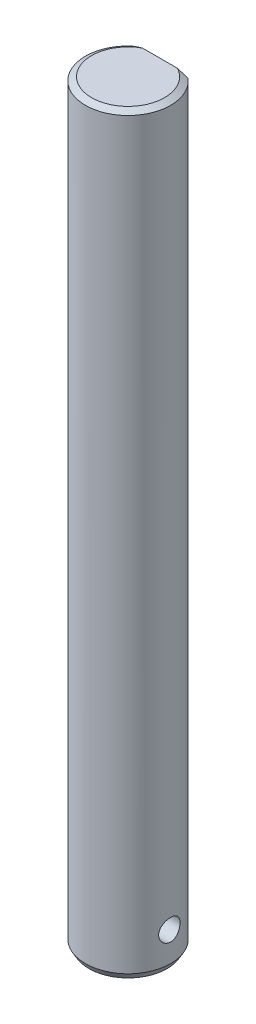
ISO-10303-21;
HEADER;
FILE_DESCRIPTION(('STEP AP214'),'2;1');
FILE_NAME('part.step','',(''),(''),'','','');
FILE_SCHEMA(('AUTOMOTIVE_DESIGN { 1 0 10303 214 1 1 1 1 }'));
ENDSEC;
DATA;
#1=APPLICATION_CONTEXT('core data for automotive mechanical design processes');
#2=APPLICATION_PROTOCOL_DEFINITION('international standard','automotive_design',2000,#1);
#3=PRODUCT_CONTEXT('',#1,'mechanical');
#4=PRODUCT('Part','Part','',(#3));
#5=PRODUCT_RELATED_PRODUCT_CATEGORY('part','',(#4));
#6=PRODUCT_DEFINITION_FORMATION('','',#4);
#7=PRODUCT_DEFINITION_CONTEXT('part definition',#1,'design');
#8=PRODUCT_DEFINITION('design','',#6,#7);
#9=PRODUCT_DEFINITION_SHAPE('','',#8);
#10=(LENGTH_UNIT() NAMED_UNIT(*) SI_UNIT(.MILLI.,.METRE.));
#11=(NAMED_UNIT(*) PLANE_ANGLE_UNIT() SI_UNIT($,.RADIAN.));
#12=(NAMED_UNIT(*) SI_UNIT($,.STERADIAN.) SOLID_ANGLE_UNIT());
#13=UNCERTAINTY_MEASURE_WITH_UNIT(LENGTH_MEASURE(1.E-05),#10,'distance_accuracy_value','');
#14=(GEOMETRIC_REPRESENTATION_CONTEXT(3) GLOBAL_UNCERTAINTY_ASSIGNED_CONTEXT((#13)) GLOBAL_UNIT_ASSIGNED_CONTEXT((#10,
#11,#12)) REPRESENTATION_CONTEXT('',''));
#15=CARTESIAN_POINT('',(0.,0.,0.));
#16=DIRECTION('',(0.,0.,1.));
#17=DIRECTION('',(1.,0.,0.));
#18=AXIS2_PLACEMENT_3D('',#15,#16,#17);
#19=CARTESIAN_POINT('',(0.,106.,0.));
#20=DIRECTION('',(0.,-1.,0.));
#21=DIRECTION('',(0.,0.,-1.));
#22=AXIS2_PLACEMENT_3D('',#19,#20,#21);
#23=CYLINDRICAL_SURFACE('',#22,6.);
#24=CARTESIAN_POINT('',(0.,0.866025403784457,0.));
#25=DIRECTION('',(0.,1.,0.));
#26=DIRECTION('',(0.,0.,1.));
#27=AXIS2_PLACEMENT_3D('',#24,#25,#26);
#28=CIRCLE('',#27,6.);
#29=CARTESIAN_POINT('',(0.,0.866025403784457,6.));
#30=VERTEX_POINT('',#29);
#31=EDGE_CURVE('E140',#30,#30,#28,.T.);
#32=ORIENTED_EDGE('',*,*,#31,.T.);
#33=EDGE_LOOP('',(#32));
#34=FACE_BOUND('',#33,.T.);
#35=CARTESIAN_POINT('',(-5.80947501931113,5.,-1.5));
#36=CARTESIAN_POINT('',(-5.80947660051185,5.08283045055477,-1.49999764715507));
#37=CARTESIAN_POINT('',(-5.81126583608348,5.1656869392068,-1.49311574729838));
#38=CARTESIAN_POINT('',(-5.81821117195949,5.32902054690442,-1.46581387527849));
#39=CARTESIAN_POINT('',(-5.82336923173088,5.409496252681,-1.44538602404532));
#40=CARTESIAN_POINT('',(-5.8364323475758,5.56568212291223,-1.39169471977917));
#41=CARTESIAN_POINT('',(-5.84433385614245,5.6413982932314,-1.35844783671268));
#42=CARTESIAN_POINT('',(-5.86198915217285,5.78618651152395,-1.28011268475685));
#43=CARTESIAN_POINT('',(-5.87174301827101,5.85525827724814,-1.23502391313642));
#44=CARTESIAN_POINT('',(-5.89224429813367,5.98631698715732,-1.13322505638713));
#45=CARTESIAN_POINT('',(-5.90300758573818,6.04813616021003,-1.07630213262243));
#46=CARTESIAN_POINT('',(-5.92417725309178,6.16145683661621,-0.9529092384604));
#47=CARTESIAN_POINT('',(-5.93458359939834,6.21295737537305,-0.886438376508185));
#48=CARTESIAN_POINT('',(-5.95404249312349,6.30486528057877,-0.744687120647373));
#49=CARTESIAN_POINT('',(-5.96307412440355,6.34510783289688,-0.669296745717072));
#50=CARTESIAN_POINT('',(-5.97858487155591,6.41228578649185,-0.512557910575658));
#51=CARTESIAN_POINT('',(-5.98506436400607,6.43922315114931,-0.431210331475164));
#52=CARTESIAN_POINT('',(-5.99462855308908,6.47848870074715,-0.266615255252497));
#53=CARTESIAN_POINT('',(-5.99777936306589,6.49110178659595,-0.183439631729385));
#54=CARTESIAN_POINT('',(-6.00056156464379,6.50225502756533,-0.0160972915576617));
#55=CARTESIAN_POINT('',(-6.00019347658022,6.50079726332576,0.068069276722841));
#56=CARTESIAN_POINT('',(-5.99602856972121,6.48405508984991,0.233028370758581));
#57=CARTESIAN_POINT('',(-5.99230801404524,6.46907820496769,0.313854323401601));
#58=CARTESIAN_POINT('',(-5.98194501914912,6.4262172379709,0.47180737112053));
#59=CARTESIAN_POINT('',(-5.97530242439065,6.39833246877356,0.548934269055657));
#60=CARTESIAN_POINT('',(-5.95972505820537,6.33019845758776,0.69811005525271));
#61=CARTESIAN_POINT('',(-5.95077011817032,6.28983977320295,0.770106764649756));
#62=CARTESIAN_POINT('',(-5.9315394228579,6.19798659253025,0.906413433510733));
#63=CARTESIAN_POINT('',(-5.92126343791494,6.14649015886363,0.970722052628258));
#64=CARTESIAN_POINT('',(-5.90018228261712,6.03217475481058,1.09166105262743));
#65=CARTESIAN_POINT('',(-5.88937031715551,5.96908706459134,1.1480365186128));
#66=CARTESIAN_POINT('',(-5.86869026110024,5.83424001587585,1.24946456394453));
#67=CARTESIAN_POINT('',(-5.85882221463582,5.7624802523054,1.29451661406903));
#68=CARTESIAN_POINT('',(-5.84112298098989,5.61182597951062,1.3721821935339));
#69=CARTESIAN_POINT('',(-5.83330190235432,5.53289856181208,1.40473435045574));
#70=CARTESIAN_POINT('',(-5.82071184083974,5.37044871915413,1.45602843095451));
#71=CARTESIAN_POINT('',(-5.81594220486131,5.28692728161012,1.47477330982937));
#72=CARTESIAN_POINT('',(-5.81013213623485,5.12002429908613,1.49749778319911));
#73=CARTESIAN_POINT('',(-5.80899653456189,5.03669732400222,1.50185428435178));
#74=CARTESIAN_POINT('',(-5.81032406088624,4.8705068380531,1.49671019430933));
#75=CARTESIAN_POINT('',(-5.8127868576076,4.78764328522926,1.48721087870928));
#76=CARTESIAN_POINT('',(-5.82094249172736,4.62613144102718,1.4549552783626));
#77=CARTESIAN_POINT('',(-5.82658182140625,4.54743636405749,1.43241844096905));
#78=CARTESIAN_POINT('',(-5.84040430962577,4.39494112528899,1.37497084900237));
#79=CARTESIAN_POINT('',(-5.84858776949168,4.3211415445668,1.34005862862753));
#80=CARTESIAN_POINT('',(-5.86677682255957,4.17893523327959,1.25806240076193));
#81=CARTESIAN_POINT('',(-5.87681501163985,4.11066269597414,1.21075305230138));
#82=CARTESIAN_POINT('',(-5.8975024984303,3.98288698231919,1.10559043940168));
#83=CARTESIAN_POINT('',(-5.90815189637082,3.92338525000996,1.04773544220816));
#84=CARTESIAN_POINT('',(-5.92918441818964,3.81331337445743,0.921394081477089));
#85=CARTESIAN_POINT('',(-5.93955421237102,3.76300396247071,0.85267792879739));
#86=CARTESIAN_POINT('',(-5.95858329968241,3.67463847982925,0.707554024042014));
#87=CARTESIAN_POINT('',(-5.96724268202376,3.63658177003508,0.631146673436387));
#88=CARTESIAN_POINT('',(-5.98182069442989,3.57413237928324,0.473337302596636));
#89=CARTESIAN_POINT('',(-5.98775898013446,3.54964142937256,0.391976071541822));
#90=CARTESIAN_POINT('',(-5.99631176037473,3.51472379923495,0.226124640478212));
#91=CARTESIAN_POINT('',(-5.99892689636045,3.50429440475657,0.141635047561866));
#92=CARTESIAN_POINT('',(-6.00051254113217,3.4979486156367,-0.0256252896649885));
#93=CARTESIAN_POINT('',(-5.99957968320012,3.50164743635692,-0.108380740449049));
#94=CARTESIAN_POINT('',(-5.99438844686135,3.5225717409415,-0.272051244622108));
#95=CARTESIAN_POINT('',(-5.99013016735643,3.53979682251965,-0.352966352671329));
#96=CARTESIAN_POINT('',(-5.97878149280944,3.58707832965639,-0.510256553467223));
#97=CARTESIAN_POINT('',(-5.97170646753999,3.61706517997194,-0.586653741871527));
#98=CARTESIAN_POINT('',(-5.95546933370076,3.68895586852899,-0.733375579562202));
#99=CARTESIAN_POINT('',(-5.94630696206604,3.73086120900435,-0.803699461897576));
#100=CARTESIAN_POINT('',(-5.92660874521999,3.82657285099561,-0.938102892635848));
#101=CARTESIAN_POINT('',(-5.91604525418417,3.88064021436107,-1.00199248245088));
#102=CARTESIAN_POINT('',(-5.89485973579863,3.9986342779607,-1.11992253040688));
#103=CARTESIAN_POINT('',(-5.88423769428834,4.06256347414686,-1.17396048760228));
#104=CARTESIAN_POINT('',(-5.86391213790822,4.199902121302,-1.27164303971884));
#105=CARTESIAN_POINT('',(-5.85422945594827,4.27346618511894,-1.31507492916982));
#106=CARTESIAN_POINT('',(-5.83715933325924,4.42708323488405,-1.3888903449235));
#107=CARTESIAN_POINT('',(-5.82977022370054,4.50713144916011,-1.41928336463958));
#108=CARTESIAN_POINT('',(-5.81927863109675,4.65586551774007,-1.46163379284816));
#109=CARTESIAN_POINT('',(-5.8156299450082,4.72383974657579,-1.47598975589307));
#110=CARTESIAN_POINT('',(-5.81072757878358,4.86120330349994,-1.4951734388599));
#111=CARTESIAN_POINT('',(-5.80947369434945,4.93059251036759,-1.50000197155828));
#112=CARTESIAN_POINT('',(-5.80947501931113,5.,-1.5));
#113=B_SPLINE_CURVE_WITH_KNOTS('',3,(#35,#36,#37,#38,#39,#40,#41,#42,#43,#44,#45,#46,#47,#48,
#49,#50,#51,#52,#53,#54,#55,#56,#57,#58,#59,#60,#61,#62,#63,#64,#65,#66,#67,#68,#69,#70,#71,#72,
#73,#74,#75,#76,#77,#78,#79,#80,#81,#82,#83,#84,#85,#86,#87,#88,#89,#90,#91,#92,#93,#94,#95,#96,
#97,#98,#99,#100,#101,#102,#103,#104,#105,#106,#107,#108,#109,#110,#111,#112),.UNSPECIFIED.,.T.,
.F.,(4,2,2,2,2,2,2,2,2,2,2,2,2,2,2,2,2,2,2,2,2,2,2,2,2,2,2,2,2,2,2,2,2,2,2,2,2,2,4),(0.,
0.248236465041681,0.4966174448572,0.744678436299613,0.99274996053287,1.24574372515786,
1.4987611288792,1.75530897838752,2.01181895908255,2.26313250597208,2.51440889199612,
2.76010957613368,3.00582334034872,3.25375724552667,3.50173431281348,3.75642279943147,
4.01112318719881,4.26705859205042,4.52293920077729,4.7720614485703,5.02116076310281,
5.26618443005524,5.51123712852851,5.76109707515495,6.01099811331027,6.26715198579191,
6.52329249431732,6.77755243684158,7.03176329345423,7.27910067676474,7.52643070426189,
7.77242925935827,8.01845883442843,8.27038257949243,8.52237018939306,8.77905886370806,
9.03556032819972,9.24358696306398,9.45159585059713),.UNSPECIFIED.);
#114=CARTESIAN_POINT('',(-5.80947501931113,5.,-1.5));
#115=VERTEX_POINT('',#114);
#116=EDGE_CURVE('E93',#115,#115,#113,.T.);
#117=ORIENTED_EDGE('',*,*,#116,.T.);
#118=EDGE_LOOP('',(#117));
#119=FACE_BOUND('',#118,.T.);
#120=CARTESIAN_POINT('',(5.80947501931113,5.,-1.5));
#121=CARTESIAN_POINT('',(5.80947660051185,4.91716954944524,-1.49999764715507));
#122=CARTESIAN_POINT('',(5.81126583608348,4.8343130607932,-1.49311574729838));
#123=CARTESIAN_POINT('',(5.81821117195949,4.67097945309558,-1.46581387527849));
#124=CARTESIAN_POINT('',(5.82336923173088,4.590503747319,-1.44538602404532));
#125=CARTESIAN_POINT('',(5.8364323475758,4.43431787708778,-1.39169471977917));
#126=CARTESIAN_POINT('',(5.84433385614245,4.3586017067686,-1.35844783671268));
#127=CARTESIAN_POINT('',(5.86198915217285,4.21381348847605,-1.28011268475685));
#128=CARTESIAN_POINT('',(5.87174301827101,4.14474172275187,-1.23502391313642));
#129=CARTESIAN_POINT('',(5.89224429813367,4.01368301284268,-1.13322505638713));
#130=CARTESIAN_POINT('',(5.90300758573818,3.95186383978997,-1.07630213262243));
#131=CARTESIAN_POINT('',(5.92417725309178,3.8385431633838,-0.952909238460399));
#132=CARTESIAN_POINT('',(5.93458359939834,3.78704262462695,-0.886438376508185));
#133=CARTESIAN_POINT('',(5.95404249312349,3.69513471942123,-0.744687120647373));
#134=CARTESIAN_POINT('',(5.96307412440355,3.65489216710312,-0.669296745717072));
#135=CARTESIAN_POINT('',(5.97858487155591,3.58771421350815,-0.512557910575658));
#136=CARTESIAN_POINT('',(5.98506436400607,3.56077684885069,-0.431210331475164));
#137=CARTESIAN_POINT('',(5.99462855308908,3.52151129925285,-0.266615255252497));
#138=CARTESIAN_POINT('',(5.99777936306589,3.50889821340405,-0.183439631729385));
#139=CARTESIAN_POINT('',(6.00056156464379,3.49774497243467,-0.0160972915576617));
#140=CARTESIAN_POINT('',(6.00019347658022,3.49920273667424,0.0680692767228411));
#141=CARTESIAN_POINT('',(5.99602856972121,3.51594491015009,0.233028370758581));
#142=CARTESIAN_POINT('',(5.99230801404524,3.53092179503231,0.3138543234016));
#143=CARTESIAN_POINT('',(5.98194501914912,3.5737827620291,0.471807371120529));
#144=CARTESIAN_POINT('',(5.97530242439065,3.60166753122645,0.548934269055657));
#145=CARTESIAN_POINT('',(5.95972505820537,3.66980154241224,0.69811005525271));
#146=CARTESIAN_POINT('',(5.95077011817032,3.71016022679705,0.770106764649757));
#147=CARTESIAN_POINT('',(5.9315394228579,3.80201340746975,0.906413433510733));
#148=CARTESIAN_POINT('',(5.92126343791494,3.85350984113637,0.970722052628258));
#149=CARTESIAN_POINT('',(5.90018228261712,3.96782524518943,1.09166105262743));
#150=CARTESIAN_POINT('',(5.88937031715551,4.03091293540867,1.1480365186128));
#151=CARTESIAN_POINT('',(5.86869026110024,4.16575998412415,1.24946456394453));
#152=CARTESIAN_POINT('',(5.85882221463582,4.2375197476946,1.29451661406903));
#153=CARTESIAN_POINT('',(5.84112298098989,4.38817402048938,1.3721821935339));
#154=CARTESIAN_POINT('',(5.83330190235432,4.46710143818792,1.40473435045574));
#155=CARTESIAN_POINT('',(5.82071184083974,4.62955128084587,1.45602843095451));
#156=CARTESIAN_POINT('',(5.81594220486131,4.71307271838988,1.47477330982937));
#157=CARTESIAN_POINT('',(5.81013213623485,4.87997570091387,1.49749778319911));
#158=CARTESIAN_POINT('',(5.80899653456189,4.96330267599778,1.50185428435178));
#159=CARTESIAN_POINT('',(5.81032406088624,5.1294931619469,1.49671019430933));
#160=CARTESIAN_POINT('',(5.8127868576076,5.21235671477075,1.48721087870928));
#161=CARTESIAN_POINT('',(5.82094249172736,5.37386855897283,1.4549552783626));
#162=CARTESIAN_POINT('',(5.82658182140625,5.45256363594251,1.43241844096905));
#163=CARTESIAN_POINT('',(5.84040430962577,5.60505887471101,1.37497084900237));
#164=CARTESIAN_POINT('',(5.84858776949168,5.6788584554332,1.34005862862753));
#165=CARTESIAN_POINT('',(5.86677682255957,5.82106476672041,1.25806240076193));
#166=CARTESIAN_POINT('',(5.87681501163985,5.88933730402586,1.21075305230138));
#167=CARTESIAN_POINT('',(5.8975024984303,6.01711301768081,1.10559043940168));
#168=CARTESIAN_POINT('',(5.90815189637082,6.07661474999005,1.04773544220816));
#169=CARTESIAN_POINT('',(5.92918441818964,6.18668662554258,0.921394081477089));
#170=CARTESIAN_POINT('',(5.93955421237102,6.23699603752929,0.852677928797389));
#171=CARTESIAN_POINT('',(5.95858329968241,6.32536152017075,0.707554024042014));
#172=CARTESIAN_POINT('',(5.96724268202376,6.36341822996493,0.631146673436387));
#173=CARTESIAN_POINT('',(5.98182069442989,6.42586762071676,0.473337302596636));
#174=CARTESIAN_POINT('',(5.98775898013446,6.45035857062744,0.391976071541822));
#175=CARTESIAN_POINT('',(5.99631176037473,6.48527620076505,0.226124640478212));
#176=CARTESIAN_POINT('',(5.99892689636045,6.49570559524343,0.141635047561866));
#177=CARTESIAN_POINT('',(6.00051254113217,6.5020513843633,-0.0256252896649894));
#178=CARTESIAN_POINT('',(5.99957968320012,6.49835256364309,-0.10838074044905));
#179=CARTESIAN_POINT('',(5.99438844686135,6.47742825905851,-0.27205124462211));
#180=CARTESIAN_POINT('',(5.99013016735643,6.46020317748035,-0.35296635267133));
#181=CARTESIAN_POINT('',(5.97878149280944,6.41292167034361,-0.510256553467224));
#182=CARTESIAN_POINT('',(5.97170646753999,6.38293482002806,-0.586653741871528));
#183=CARTESIAN_POINT('',(5.95546933370076,6.31104413147101,-0.733375579562203));
#184=CARTESIAN_POINT('',(5.94630696206604,6.26913879099565,-0.803699461897577));
#185=CARTESIAN_POINT('',(5.92660874521999,6.17342714900439,-0.938102892635849));
#186=CARTESIAN_POINT('',(5.91604525418417,6.11935978563894,-1.00199248245088));
#187=CARTESIAN_POINT('',(5.89485973579863,6.0013657220393,-1.11992253040688));
#188=CARTESIAN_POINT('',(5.88423769428834,5.93743652585314,-1.17396048760228));
#189=CARTESIAN_POINT('',(5.86391213790822,5.800097878698,-1.27164303971884));
#190=CARTESIAN_POINT('',(5.85422945594827,5.72653381488106,-1.31507492916982));
#191=CARTESIAN_POINT('',(5.83715933325924,5.57291676511595,-1.3888903449235));
#192=CARTESIAN_POINT('',(5.82977022370054,5.49286855083989,-1.41928336463958));
#193=CARTESIAN_POINT('',(5.81927863109675,5.34413448225993,-1.46163379284816));
#194=CARTESIAN_POINT('',(5.8156299450082,5.27616025342421,-1.47598975589307));
#195=CARTESIAN_POINT('',(5.81072757878358,5.13879669650006,-1.4951734388599));
#196=CARTESIAN_POINT('',(5.80947369434945,5.06940748963241,-1.50000197155828));
#197=CARTESIAN_POINT('',(5.80947501931113,5.,-1.5));
#198=B_SPLINE_CURVE_WITH_KNOTS('',3,(#120,#121,#122,#123,#124,#125,#126,#127,#128,#129,#130,
#131,#132,#133,#134,#135,#136,#137,#138,#139,#140,#141,#142,#143,#144,#145,#146,#147,#148,#149,
#150,#151,#152,#153,#154,#155,#156,#157,#158,#159,#160,#161,#162,#163,#164,#165,#166,#167,#168,
#169,#170,#171,#172,#173,#174,#175,#176,#177,#178,#179,#180,#181,#182,#183,#184,#185,#186,#187,
#188,#189,#190,#191,#192,#193,#194,#195,#196,#197),.UNSPECIFIED.,.T.,.F.,(4,2,2,2,2,2,2,2,2,2,2,
2,2,2,2,2,2,2,2,2,2,2,2,2,2,2,2,2,2,2,2,2,2,2,2,2,2,2,4),(0.,0.248236465041681,0.4966174448572,
0.744678436299613,0.99274996053287,1.24574372515786,1.4987611288792,1.75530897838752,
2.01181895908255,2.26313250597208,2.51440889199612,2.76010957613368,3.00582334034872,
3.25375724552667,3.50173431281348,3.75642279943147,4.01112318719881,4.26705859205042,
4.52293920077729,4.7720614485703,5.02116076310281,5.26618443005524,5.51123712852851,
5.76109707515494,6.01099811331027,6.26715198579191,6.52329249431732,6.77755243684158,
7.03176329345423,7.27910067676474,7.52643070426189,7.77242925935827,8.01845883442843,
8.27038257949242,8.52237018939305,8.77905886370806,9.03556032819972,9.24358696306398,
9.45159585059712),.UNSPECIFIED.);
#199=CARTESIAN_POINT('',(5.80947501931113,5.,-1.5));
#200=VERTEX_POINT('',#199);
#201=EDGE_CURVE('E97',#200,#200,#198,.T.);
#202=ORIENTED_EDGE('',*,*,#201,.T.);
#203=EDGE_LOOP('',(#202));
#204=FACE_BOUND('',#203,.T.);
#205=DIRECTION('',(0.,-1.,0.));
#206=VECTOR('',#205,1.);
#207=CARTESIAN_POINT('',(3.96862696659689,106.,-4.5));
#208=LINE('',#207,#206);
#209=CARTESIAN_POINT('',(3.96862696659689,96.,-4.5));
#210=VERTEX_POINT('',#209);
#211=CARTESIAN_POINT('',(3.96862696659689,105.5,-4.5));
#212=VERTEX_POINT('',#211);
#213=EDGE_CURVE('E84',#210,#212,#208,.F.);
#214=ORIENTED_EDGE('',*,*,#213,.T.);
#215=CARTESIAN_POINT('',(0.,105.5,0.));
#216=DIRECTION('',(0.,1.,0.));
#217=DIRECTION('',(0.,0.,1.));
#218=AXIS2_PLACEMENT_3D('',#215,#216,#217);
#219=CIRCLE('',#218,6.);
#220=CARTESIAN_POINT('',(-3.96862696659689,105.5,-4.5));
#221=VERTEX_POINT('',#220);
#222=EDGE_CURVE('E54',#212,#221,#219,.F.);
#223=ORIENTED_EDGE('',*,*,#222,.T.);
#224=DIRECTION('',(0.,-1.,0.));
#225=VECTOR('',#224,1.);
#226=CARTESIAN_POINT('',(-3.96862696659689,106.,-4.5));
#227=LINE('',#226,#225);
#228=CARTESIAN_POINT('',(-3.96862696659689,96.,-4.5));
#229=VERTEX_POINT('',#228);
#230=EDGE_CURVE('E78',#221,#229,#227,.T.);
#231=ORIENTED_EDGE('',*,*,#230,.T.);
#232=CARTESIAN_POINT('',(0.,96.,0.));
#233=DIRECTION('',(0.,1.,0.));
#234=DIRECTION('',(0.,0.,1.));
#235=AXIS2_PLACEMENT_3D('',#232,#233,#234);
#236=CIRCLE('',#235,6.);
#237=EDGE_CURVE('E80',#210,#229,#236,.T.);
#238=ORIENTED_EDGE('',*,*,#237,.F.);
#239=EDGE_LOOP('',(#214,#223,#231,#238));
#240=FACE_BOUND('',#239,.T.);
#241=ADVANCED_FACE('F45',(#34,#119,#204,#240),#23,.T.);
#242=CARTESIAN_POINT('',(0.,106.,0.));
#243=DIRECTION('',(0.,1.,0.));
#244=DIRECTION('',(0.,0.,1.));
#245=AXIS2_PLACEMENT_3D('',#242,#243,#244);
#246=PLANE('',#245);
#247=DIRECTION('',(1.,0.,0.));
#248=VECTOR('',#247,1.);
#249=CARTESIAN_POINT('',(0.,106.,-4.5));
#250=LINE('',#249,#248);
#251=CARTESIAN_POINT('',(-2.47137515456208,106.,-4.5));
#252=VERTEX_POINT('',#251);
#253=CARTESIAN_POINT('',(2.47137515456208,106.,-4.5));
#254=VERTEX_POINT('',#253);
#255=EDGE_CURVE('E83',#252,#254,#250,.T.);
#256=ORIENTED_EDGE('',*,*,#255,.F.);
#257=CARTESIAN_POINT('',(0.,106.,0.));
#258=DIRECTION('',(0.,1.,0.));
#259=DIRECTION('',(0.,0.,1.));
#260=AXIS2_PLACEMENT_3D('',#257,#258,#259);
#261=CIRCLE('',#260,5.13397459621556);
#262=EDGE_CURVE('E90',#252,#254,#261,.T.);
#263=ORIENTED_EDGE('',*,*,#262,.T.);
#264=EDGE_LOOP('',(#256,#263));
#265=FACE_BOUND('',#264,.T.);
#266=ADVANCED_FACE('F126',(#265),#246,.T.);
#267=CARTESIAN_POINT('',(0.,0.,0.));
#268=DIRECTION('',(0.,1.,0.));
#269=DIRECTION('',(0.,0.,1.));
#270=AXIS2_PLACEMENT_3D('',#267,#268,#269);
#271=PLANE('',#270);
#272=CARTESIAN_POINT('',(0.,0.,0.));
#273=DIRECTION('',(0.,1.,0.));
#274=DIRECTION('',(0.,0.,1.));
#275=AXIS2_PLACEMENT_3D('',#272,#273,#274);
#276=CIRCLE('',#275,5.49999999999999);
#277=CARTESIAN_POINT('',(0.,0.,5.49999999999999));
#278=VERTEX_POINT('',#277);
#279=EDGE_CURVE('E11',#278,#278,#276,.F.);
#280=ORIENTED_EDGE('',*,*,#279,.T.);
#281=EDGE_LOOP('',(#280));
#282=FACE_BOUND('',#281,.T.);
#283=ADVANCED_FACE('F122',(#282),#271,.F.);
#284=CARTESIAN_POINT('',(0.,96.,0.));
#285=DIRECTION('',(0.,1.,0.));
#286=DIRECTION('',(0.,0.,1.));
#287=AXIS2_PLACEMENT_3D('',#284,#285,#286);
#288=PLANE('',#287);
#289=ORIENTED_EDGE('',*,*,#237,.T.);
#290=DIRECTION('',(1.,0.,0.));
#291=VECTOR('',#290,1.);
#292=CARTESIAN_POINT('',(-9.56252888951005,96.,-4.5));
#293=LINE('',#292,#291);
#294=EDGE_CURVE('E89',#229,#210,#293,.T.);
#295=ORIENTED_EDGE('',*,*,#294,.T.);
#296=EDGE_LOOP('',(#289,#295));
#297=FACE_BOUND('',#296,.T.);
#298=ADVANCED_FACE('F88',(#297),#288,.T.);
#299=CARTESIAN_POINT('',(-9.56252888951005,96.,-4.5));
#300=DIRECTION('',(0.,0.,1.));
#301=DIRECTION('',(1.,0.,0.));
#302=AXIS2_PLACEMENT_3D('',#299,#300,#301);
#303=PLANE('',#302);
#304=ORIENTED_EDGE('',*,*,#255,.T.);
#305=CARTESIAN_POINT('',(2.47137515456208,106.,-4.5));
#306=CARTESIAN_POINT('',(2.59821029234091,105.964741067028,-4.5));
#307=CARTESIAN_POINT('',(2.72449842776643,105.927566203446,-4.5));
#308=CARTESIAN_POINT('',(2.97597185015973,105.849882020878,-4.5));
#309=CARTESIAN_POINT('',(3.10115769990573,105.809374527543,-4.5));
#310=CARTESIAN_POINT('',(3.35054029678143,105.725488234176,-4.5));
#311=CARTESIAN_POINT('',(3.47473716361617,105.682109787745,-4.5));
#312=CARTESIAN_POINT('',(3.72230196848673,105.592839293428,-4.5));
#313=CARTESIAN_POINT('',(3.84566941885811,105.54694589105,-4.5));
#314=CARTESIAN_POINT('',(3.96862696659689,105.5,-4.5));
#315=B_SPLINE_CURVE_WITH_KNOTS('',3,(#305,#306,#307,#308,#309,#310,#311,#312,#313,#314),
.UNSPECIFIED.,.F.,.F.,(4,2,2,2,4),(0.,0.394899349737702,0.789583791657925,1.18421971236831,
1.57907030390004),.UNSPECIFIED.);
#316=EDGE_CURVE('E68',#254,#212,#315,.T.);
#317=ORIENTED_EDGE('',*,*,#316,.T.);
#318=ORIENTED_EDGE('',*,*,#213,.F.);
#319=ORIENTED_EDGE('',*,*,#294,.F.);
#320=ORIENTED_EDGE('',*,*,#230,.F.);
#321=CARTESIAN_POINT('',(-3.96862696659689,105.5,-4.5));
#322=CARTESIAN_POINT('',(-3.84566941885811,105.54694589105,-4.5));
#323=CARTESIAN_POINT('',(-3.72230196848673,105.592839293428,-4.5));
#324=CARTESIAN_POINT('',(-3.47473716361617,105.682109787745,-4.5));
#325=CARTESIAN_POINT('',(-3.35054029678143,105.725488234176,-4.5));
#326=CARTESIAN_POINT('',(-3.10115769990573,105.809374527543,-4.5));
#327=CARTESIAN_POINT('',(-2.97597185015973,105.849882020878,-4.5));
#328=CARTESIAN_POINT('',(-2.72449842776643,105.927566203446,-4.5));
#329=CARTESIAN_POINT('',(-2.59821029234091,105.964741067028,-4.5));
#330=CARTESIAN_POINT('',(-2.47137515456208,106.,-4.5));
#331=B_SPLINE_CURVE_WITH_KNOTS('',3,(#321,#322,#323,#324,#325,#326,#327,#328,#329,#330),
.UNSPECIFIED.,.F.,.F.,(4,2,2,2,4),(0.,0.394850591531729,0.789486512242111,1.18417095416234,
1.57907030390004),.UNSPECIFIED.);
#332=EDGE_CURVE('E129',#221,#252,#331,.T.);
#333=ORIENTED_EDGE('',*,*,#332,.T.);
#334=EDGE_LOOP('',(#304,#317,#318,#319,#320,#333));
#335=FACE_BOUND('',#334,.T.);
#336=ADVANCED_FACE('F92',(#335),#303,.F.);
#337=CARTESIAN_POINT('',(-20.,5.,0.));
#338=DIRECTION('',(1.,0.,0.));
#339=DIRECTION('',(0.,0.,-1.));
#340=AXIS2_PLACEMENT_3D('',#337,#338,#339);
#341=CYLINDRICAL_SURFACE('',#340,1.5);
#342=ORIENTED_EDGE('',*,*,#201,.F.);
#343=EDGE_LOOP('',(#342));
#344=FACE_BOUND('',#343,.T.);
#345=ORIENTED_EDGE('',*,*,#116,.F.);
#346=EDGE_LOOP('',(#345));
#347=FACE_BOUND('',#346,.T.);
#348=ADVANCED_FACE('F113',(#344,#347),#341,.F.);
#349=CARTESIAN_POINT('',(0.,106.,0.));
#350=DIRECTION('',(0.,-1.,0.));
#351=DIRECTION('',(0.,0.,-1.));
#352=AXIS2_PLACEMENT_3D('',#349,#350,#351);
#353=CONICAL_SURFACE('',#352,5.13397459621556,1.04719755119659);
#354=ORIENTED_EDGE('',*,*,#332,.F.);
#355=ORIENTED_EDGE('',*,*,#222,.F.);
#356=ORIENTED_EDGE('',*,*,#316,.F.);
#357=ORIENTED_EDGE('',*,*,#262,.F.);
#358=EDGE_LOOP('',(#354,#355,#356,#357));
#359=FACE_BOUND('',#358,.T.);
#360=ADVANCED_FACE('F117',(#359),#353,.T.);
#361=CARTESIAN_POINT('',(0.,0.866025403784457,0.));
#362=DIRECTION('',(0.,1.,0.));
#363=DIRECTION('',(0.,0.,1.));
#364=AXIS2_PLACEMENT_3D('',#361,#362,#363);
#365=CONICAL_SURFACE('',#364,6.,0.523598775598298);
#366=ORIENTED_EDGE('',*,*,#279,.F.);
#367=EDGE_LOOP('',(#366));
#368=FACE_BOUND('',#367,.T.);
#369=ORIENTED_EDGE('',*,*,#31,.F.);
#370=EDGE_LOOP('',(#369));
#371=FACE_BOUND('',#370,.T.);
#372=ADVANCED_FACE('F48',(#368,#371),#365,.T.);
#373=CLOSED_SHELL('',(#241,#266,#283,#298,#336,#348,#360,#372));
#374=MANIFOLD_SOLID_BREP('B2',#373);
#375=ADVANCED_BREP_SHAPE_REPRESENTATION('',(#18,#374),#14);
#376=SHAPE_DEFINITION_REPRESENTATION(#9,#375);
ENDSEC;
END-ISO-10303-21;
